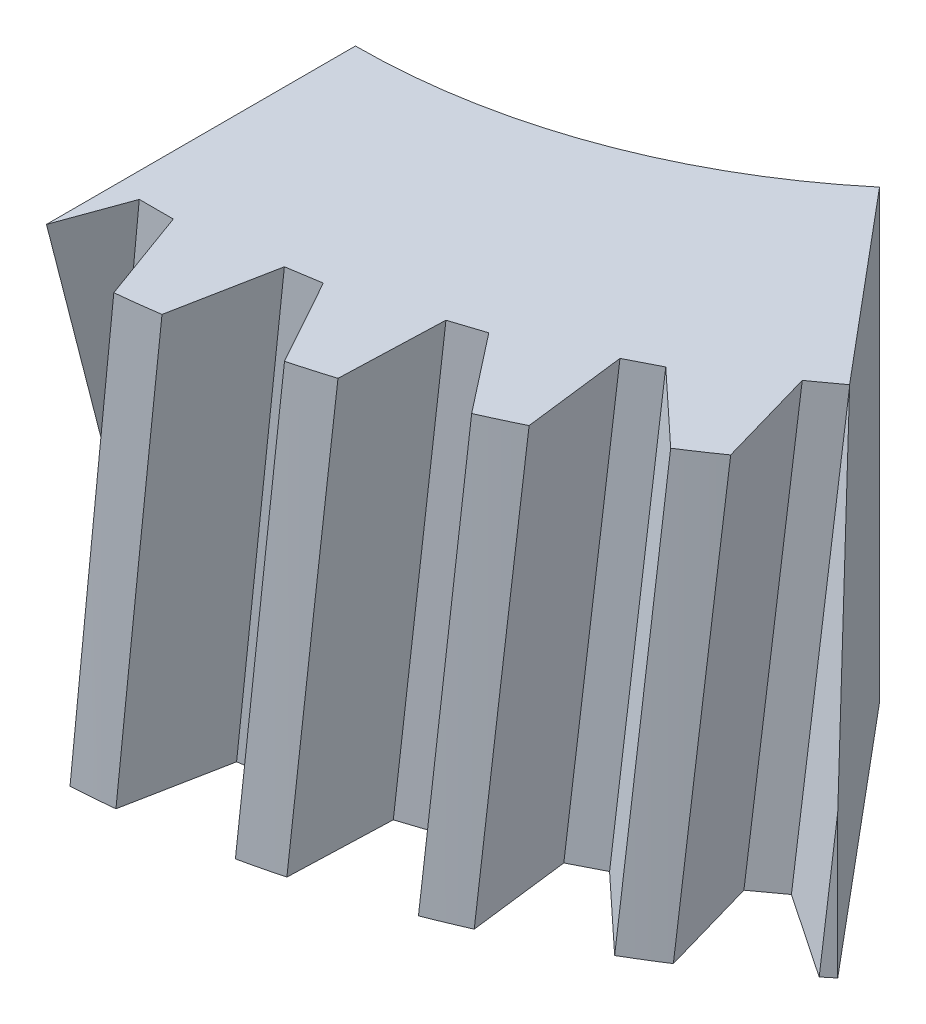
ISO-10303-21;
HEADER;
FILE_DESCRIPTION(('STEP AP214'),'2;1');
FILE_NAME('part.step','',(''),(''),'','','');
FILE_SCHEMA(('AUTOMOTIVE_DESIGN { 1 0 10303 214 1 1 1 1 }'));
ENDSEC;
DATA;
#1=APPLICATION_CONTEXT('core data for automotive mechanical design processes');
#2=APPLICATION_PROTOCOL_DEFINITION('international standard','automotive_design',2000,#1);
#3=PRODUCT_CONTEXT('',#1,'mechanical');
#4=PRODUCT('Part','Part','',(#3));
#5=PRODUCT_RELATED_PRODUCT_CATEGORY('part','',(#4));
#6=PRODUCT_DEFINITION_FORMATION('','',#4);
#7=PRODUCT_DEFINITION_CONTEXT('part definition',#1,'design');
#8=PRODUCT_DEFINITION('design','',#6,#7);
#9=PRODUCT_DEFINITION_SHAPE('','',#8);
#10=(LENGTH_UNIT() NAMED_UNIT(*) SI_UNIT(.MILLI.,.METRE.));
#11=(NAMED_UNIT(*) PLANE_ANGLE_UNIT() SI_UNIT($,.RADIAN.));
#12=(NAMED_UNIT(*) SI_UNIT($,.STERADIAN.) SOLID_ANGLE_UNIT());
#13=UNCERTAINTY_MEASURE_WITH_UNIT(LENGTH_MEASURE(1.E-05),#10,'distance_accuracy_value','');
#14=(GEOMETRIC_REPRESENTATION_CONTEXT(3) GLOBAL_UNCERTAINTY_ASSIGNED_CONTEXT((#13)) GLOBAL_UNIT_ASSIGNED_CONTEXT((#10,
#11,#12)) REPRESENTATION_CONTEXT('',''));
#15=CARTESIAN_POINT('',(0.,0.,0.));
#16=DIRECTION('',(0.,0.,1.));
#17=DIRECTION('',(1.,0.,0.));
#18=AXIS2_PLACEMENT_3D('',#15,#16,#17);
#19=CARTESIAN_POINT('',(0.,0.,0.));
#20=DIRECTION('',(0.,1.,0.));
#21=DIRECTION('',(0.,0.,1.));
#22=AXIS2_PLACEMENT_3D('',#19,#20,#21);
#23=PLANE('',#22);
#24=DIRECTION('',(-0.642787609686541,0.,-0.766044443118977));
#25=VECTOR('',#24,1.);
#26=CARTESIAN_POINT('',(0.,0.,0.));
#27=LINE('',#26,#25);
#28=CARTESIAN_POINT('',(20.247809705126,0.,24.1303999582478));
#29=VERTEX_POINT('',#28);
#30=CARTESIAN_POINT('',(12.9200309546995,0.,15.3974933066914));
#31=VERTEX_POINT('',#30);
#32=EDGE_CURVE('E201',#29,#31,#27,.T.);
#33=ORIENTED_EDGE('',*,*,#32,.F.);
#34=CARTESIAN_POINT('',(0.,0.,0.));
#35=DIRECTION('',(0.,1.,0.));
#36=DIRECTION('',(0.,0.,1.));
#37=AXIS2_PLACEMENT_3D('',#34,#35,#36);
#38=CIRCLE('',#37,31.5);
#39=CARTESIAN_POINT('',(19.9064588685512,0.,24.4127609113488));
#40=VERTEX_POINT('',#39);
#41=EDGE_CURVE('E215',#40,#29,#38,.T.);
#42=ORIENTED_EDGE('',*,*,#41,.F.);
#43=DIRECTION('',(0.829037572555041,0.,0.559192903470748));
#44=VECTOR('',#43,1.);
#45=CARTESIAN_POINT('',(17.0116780244633,0.,22.4602065776191));
#46=LINE('',#45,#44);
#47=CARTESIAN_POINT('',(17.0382315397724,0.,22.4781171498472));
#48=VERTEX_POINT('',#47);
#49=EDGE_CURVE('E298',#48,#40,#46,.T.);
#50=ORIENTED_EDGE('',*,*,#49,.F.);
#51=DIRECTION('',(0.809016994374949,0.,-0.587785252292471));
#52=VECTOR('',#51,1.);
#53=CARTESIAN_POINT('',(16.0370942814478,0.,23.2054859443907));
#54=LINE('',#53,#52);
#55=CARTESIAN_POINT('',(16.112856689523,0.,23.1504413328999));
#56=VERTEX_POINT('',#55);
#57=EDGE_CURVE('E305',#56,#48,#54,.T.);
#58=ORIENTED_EDGE('',*,*,#57,.F.);
#59=DIRECTION('',(-0.275637355816996,0.,-0.96126169593832));
#60=VECTOR('',#59,1.);
#61=CARTESIAN_POINT('',(16.1216851684602,0.,23.1812298978626));
#62=LINE('',#61,#60);
#63=CARTESIAN_POINT('',(17.0664812572855,0.,26.4761254245164));
#64=VERTEX_POINT('',#63);
#65=EDGE_CURVE('E301',#64,#56,#62,.T.);
#66=ORIENTED_EDGE('',*,*,#65,.F.);
#67=CARTESIAN_POINT('',(15.8423801336828,0.,27.2262555578231));
#68=VERTEX_POINT('',#67);
#69=EDGE_CURVE('E224',#68,#64,#38,.T.);
#70=ORIENTED_EDGE('',*,*,#69,.F.);
#71=DIRECTION('',(0.731353701619169,0.,0.6819983600625));
#72=VECTOR('',#71,1.);
#73=CARTESIAN_POINT('',(13.288685638529,0.,24.8448969157054));
#74=LINE('',#73,#72);
#75=CARTESIAN_POINT('',(13.3121104047455,0.,24.8667408635916));
#76=VERTEX_POINT('',#75);
#77=EDGE_CURVE('E280',#76,#68,#74,.T.);
#78=ORIENTED_EDGE('',*,*,#77,.F.);
#79=DIRECTION('',(0.891006524188369,0.,-0.453990499739545));
#80=VECTOR('',#79,1.);
#81=CARTESIAN_POINT('',(12.2095132607794,0.,25.4285421689821));
#82=LINE('',#81,#80);
#83=CARTESIAN_POINT('',(12.2929537805648,0.,25.3860271006324));
#84=VERTEX_POINT('',#83);
#85=EDGE_CURVE('E278',#84,#76,#82,.T.);
#86=ORIENTED_EDGE('',*,*,#85,.F.);
#87=DIRECTION('',(-0.121869343405145,0.,-0.992546151641322));
#88=VECTOR('',#87,1.);
#89=CARTESIAN_POINT('',(12.2968571735085,0.,25.4178176850102));
#90=LINE('',#89,#88);
#91=CARTESIAN_POINT('',(12.7145860356841,0.,28.8199462515319));
#92=VERTEX_POINT('',#91);
#93=EDGE_CURVE('E268',#92,#84,#90,.T.);
#94=ORIENTED_EDGE('',*,*,#93,.F.);
#95=CARTESIAN_POINT('',(11.3882094220779,0.,29.3693494337021));
#96=VERTEX_POINT('',#95);
#97=EDGE_CURVE('E230',#96,#92,#38,.T.);
#98=ORIENTED_EDGE('',*,*,#97,.F.);
#99=DIRECTION('',(0.615661475325656,0.,0.788010753606723));
#100=VECTOR('',#99,1.);
#101=CARTESIAN_POINT('',(9.23848170950866,0.,26.6178234365055));
#102=LINE('',#101,#100);
#103=CARTESIAN_POINT('',(9.25820093119235,0.,26.6430628892929));
#104=VERTEX_POINT('',#103);
#105=EDGE_CURVE('E433',#104,#96,#102,.T.);
#106=ORIENTED_EDGE('',*,*,#105,.F.);
#107=DIRECTION('',(0.951056516295155,0.,-0.309016994374945));
#108=VECTOR('',#107,1.);
#109=CARTESIAN_POINT('',(8.08129350325807,0.,27.0254632932716));
#110=LINE('',#109,#108);
#111=CARTESIAN_POINT('',(8.17035755155453,0.,26.9965246297538));
#112=VERTEX_POINT('',#111);
#113=EDGE_CURVE('E440',#112,#104,#110,.T.);
#114=ORIENTED_EDGE('',*,*,#113,.F.);
#115=DIRECTION('',(0.0348994967025044,0.,-0.999390827019096));
#116=VECTOR('',#115,1.);
#117=CARTESIAN_POINT('',(8.16923974422094,0.,27.0285344436799));
#118=LINE('',#117,#116);
#119=CARTESIAN_POINT('',(8.04961550859229,0.,30.4541243539168));
#120=VERTEX_POINT('',#119);
#121=EDGE_CURVE('E436',#120,#112,#118,.T.);
#122=ORIENTED_EDGE('',*,*,#121,.F.);
#123=CARTESIAN_POINT('',(6.65362319920122,0.,30.7892724552408));
#124=VERTEX_POINT('',#123);
#125=EDGE_CURVE('E237',#124,#120,#38,.T.);
#126=ORIENTED_EDGE('',*,*,#125,.F.);
#127=DIRECTION('',(0.484809620246335,0.,0.874619707139397));
#128=VECTOR('',#127,1.);
#129=CARTESIAN_POINT('',(4.96079569958347,0.,27.7353308044937));
#130=LINE('',#129,#128);
#131=CARTESIAN_POINT('',(4.97632382450596,0.,27.7633442834037));
#132=VERTEX_POINT('',#131);
#133=EDGE_CURVE('E411',#132,#124,#130,.T.);
#134=ORIENTED_EDGE('',*,*,#133,.F.);
#135=DIRECTION('',(0.987688340595138,0.,-0.156434465040228));
#136=VECTOR('',#135,1.);
#137=CARTESIAN_POINT('',(3.75408547809484,0.,27.9569278198432));
#138=LINE('',#137,#136);
#139=CARTESIAN_POINT('',(3.84658000376288,0.,27.9422781261622));
#140=VERTEX_POINT('',#139);
#141=EDGE_CURVE('E418',#140,#132,#138,.T.);
#142=ORIENTED_EDGE('',*,*,#141,.F.);
#143=DIRECTION('',(0.190808995376549,0.,-0.981627183447663));
#144=VECTOR('',#143,1.);
#145=CARTESIAN_POINT('',(3.84046852042425,0.,27.9737189823154));
#146=LINE('',#145,#144);
#147=CARTESIAN_POINT('',(3.18643673253675,0.,31.3384208432643));
#148=VERTEX_POINT('',#147);
#149=EDGE_CURVE('E414',#148,#140,#146,.T.);
#150=ORIENTED_EDGE('',*,*,#149,.F.);
#151=CARTESIAN_POINT('',(1.75520269105084,0.,31.4510614051947));
#152=VERTEX_POINT('',#151);
#153=EDGE_CURVE('E227',#152,#148,#38,.T.);
#154=ORIENTED_EDGE('',*,*,#153,.F.);
#155=DIRECTION('',(0.342020143325666,0.,0.939692620785909));
#156=VECTOR('',#155,1.);
#157=CARTESIAN_POINT('',(0.560958435651995,0.,28.1699022801729));
#158=LINE('',#157,#156);
#159=CARTESIAN_POINT('',(0.57191310978833,0.,28.2));
#160=VERTEX_POINT('',#159);
#161=EDGE_CURVE('E399',#160,#152,#158,.T.);
#162=ORIENTED_EDGE('',*,*,#161,.F.);
#163=DIRECTION('',(1.,0.,0.));
#164=VECTOR('',#163,1.);
#165=CARTESIAN_POINT('',(-0.665560589526791,0.,28.2));
#166=LINE('',#165,#164);
#167=CARTESIAN_POINT('',(0.,0.,28.2));
#168=VERTEX_POINT('',#167);
#169=EDGE_CURVE('E404',#168,#160,#166,.T.);
#170=ORIENTED_EDGE('',*,*,#169,.F.);
#171=DIRECTION('',(0.,0.,1.));
#172=VECTOR('',#171,1.);
#173=CARTESIAN_POINT('',(0.,0.,0.));
#174=LINE('',#173,#172);
#175=CARTESIAN_POINT('',(0.,0.,20.1));
#176=VERTEX_POINT('',#175);
#177=EDGE_CURVE('E68',#176,#168,#174,.T.);
#178=ORIENTED_EDGE('',*,*,#177,.F.);
#179=CARTESIAN_POINT('',(0.,0.,0.));
#180=DIRECTION('',(0.,1.,0.));
#181=DIRECTION('',(0.,0.,1.));
#182=AXIS2_PLACEMENT_3D('',#179,#180,#181);
#183=CIRCLE('',#182,20.1);
#184=EDGE_CURVE('E217',#176,#31,#183,.T.);
#185=ORIENTED_EDGE('',*,*,#184,.T.);
#186=EDGE_LOOP('',(#33,#42,#50,#58,#66,#70,#78,#86,#94,#98,#106,#114,#122,#126,#134,#142,#150,
#154,#162,#170,#178,#185));
#187=FACE_BOUND('',#186,.T.);
#188=ADVANCED_FACE('F45',(#187),#23,.F.);
#189=CARTESIAN_POINT('',(0.,15.,0.));
#190=DIRECTION('',(0.,-1.,0.));
#191=DIRECTION('',(0.,0.,-1.));
#192=AXIS2_PLACEMENT_3D('',#189,#190,#191);
#193=CYLINDRICAL_SURFACE('',#192,31.5);
#194=DIRECTION('',(0.,1.,0.));
#195=VECTOR('',#194,1.);
#196=CARTESIAN_POINT('',(20.247809705126,0.,24.1303999582478));
#197=LINE('',#196,#195);
#198=CARTESIAN_POINT('',(20.247809705126,4.82920141502459,24.1303999582478));
#199=VERTEX_POINT('',#198);
#200=EDGE_CURVE('E198',#29,#199,#197,.T.);
#201=ORIENTED_EDGE('',*,*,#200,.T.);
#202=CARTESIAN_POINT('',(0.,103.495059418198,0.));
#203=DIRECTION('',(0.557040212659675,-0.0876610419991453,-0.825846077181268));
#204=DIRECTION('',(-0.0490194325967733,-0.996150360997588,0.0726742974666169));
#205=AXIS2_PLACEMENT_3D('',#202,#203,#204);
#206=ELLIPSE('',#205,359.338644415237,31.5);
#207=EDGE_CURVE('E221',#199,#40,#206,.T.);
#208=ORIENTED_EDGE('',*,*,#207,.T.);
#209=ORIENTED_EDGE('',*,*,#41,.T.);
#210=EDGE_LOOP('',(#201,#208,#209));
#211=FACE_BOUND('',#210,.T.);
#212=ADVANCED_FACE('F47',(#211),#193,.T.);
#213=CARTESIAN_POINT('',(0.,15.,0.));
#214=DIRECTION('',(0.,1.,0.));
#215=DIRECTION('',(0.,0.,1.));
#216=AXIS2_PLACEMENT_3D('',#213,#214,#215);
#217=PLANE('',#216);
#218=DIRECTION('',(-0.809016994374949,0.,0.587785252292471));
#219=VECTOR('',#218,1.);
#220=CARTESIAN_POINT('',(16.5755441146477,15.,22.8142792413736));
#221=LINE('',#220,#219);
#222=CARTESIAN_POINT('',(18.1708739287861,15.,21.6552042852071));
#223=VERTEX_POINT('',#222);
#224=CARTESIAN_POINT('',(17.2492922612863,15.,22.3247725596758));
#225=VERTEX_POINT('',#224);
#226=EDGE_CURVE('E322',#223,#225,#221,.T.);
#227=ORIENTED_EDGE('',*,*,#226,.F.);
#228=DIRECTION('',(-0.642787609686541,0.,-0.766044443118977));
#229=VECTOR('',#228,1.);
#230=CARTESIAN_POINT('',(0.,15.,0.));
#231=LINE('',#230,#229);
#232=CARTESIAN_POINT('',(12.9200309546995,15.,15.3974933066914));
#233=VERTEX_POINT('',#232);
#234=EDGE_CURVE('E60',#223,#233,#231,.T.);
#235=ORIENTED_EDGE('',*,*,#234,.T.);
#236=CARTESIAN_POINT('',(0.,15.,0.));
#237=DIRECTION('',(0.,1.,0.));
#238=DIRECTION('',(0.,0.,1.));
#239=AXIS2_PLACEMENT_3D('',#236,#237,#238);
#240=CIRCLE('',#239,20.1);
#241=CARTESIAN_POINT('',(0.,15.,20.1));
#242=VERTEX_POINT('',#241);
#243=EDGE_CURVE('E225',#242,#233,#240,.T.);
#244=ORIENTED_EDGE('',*,*,#243,.F.);
#245=DIRECTION('',(0.,0.,1.));
#246=VECTOR('',#245,1.);
#247=CARTESIAN_POINT('',(0.,15.,0.));
#248=LINE('',#247,#246);
#249=CARTESIAN_POINT('',(0.,15.,30.4880950983221));
#250=VERTEX_POINT('',#249);
#251=EDGE_CURVE('E219',#242,#250,#248,.T.);
#252=ORIENTED_EDGE('',*,*,#251,.T.);
#253=DIRECTION('',(-0.342020143325673,0.,0.939692620785907));
#254=VECTOR('',#253,1.);
#255=CARTESIAN_POINT('',(9.79868488607328,15.,3.56642963348484));
#256=LINE('',#255,#254);
#257=CARTESIAN_POINT('',(0.832798508959667,15.,28.2));
#258=VERTEX_POINT('',#257);
#259=EDGE_CURVE('E374',#258,#250,#256,.T.);
#260=ORIENTED_EDGE('',*,*,#259,.F.);
#261=DIRECTION('',(-1.,0.,0.));
#262=VECTOR('',#261,1.);
#263=CARTESIAN_POINT('',(0.,15.,28.2));
#264=LINE('',#263,#262);
#265=CARTESIAN_POINT('',(1.97662472853652,15.,28.2));
#266=VERTEX_POINT('',#265);
#267=EDGE_CURVE('E366',#266,#258,#264,.T.);
#268=ORIENTED_EDGE('',*,*,#267,.F.);
#269=DIRECTION('',(-0.342020143325666,0.,-0.939692620785909));
#270=VECTOR('',#269,1.);
#271=CARTESIAN_POINT('',(-7.3179017375984,15.,2.66349840977071));
#272=LINE('',#271,#270);
#273=CARTESIAN_POINT('',(3.12130210554712,15.,31.3449752458972));
#274=VERTEX_POINT('',#273);
#275=EDGE_CURVE('E370',#274,#266,#272,.T.);
#276=ORIENTED_EDGE('',*,*,#275,.F.);
#277=CARTESIAN_POINT('',(0.,15.,0.));
#278=DIRECTION('',(0.,1.,0.));
#279=DIRECTION('',(0.,0.,1.));
#280=AXIS2_PLACEMENT_3D('',#277,#278,#279);
#281=CIRCLE('',#280,31.5);
#282=CARTESIAN_POINT('',(4.56435217650809,15.,31.1675582811488));
#283=VERTEX_POINT('',#282);
#284=EDGE_CURVE('E246',#274,#283,#281,.T.);
#285=ORIENTED_EDGE('',*,*,#284,.T.);
#286=DIRECTION('',(-0.190808995376549,0.,0.981627183447663));
#287=VECTOR('',#286,1.);
#288=CARTESIAN_POINT('',(10.2359593269582,15.,1.98966893829529));
#289=LINE('',#288,#287);
#290=CARTESIAN_POINT('',(5.233997291499,15.,27.7225328155475));
#291=VERTEX_POINT('',#290);
#292=EDGE_CURVE('E363',#291,#283,#289,.T.);
#293=ORIENTED_EDGE('',*,*,#292,.F.);
#294=DIRECTION('',(-0.987688340595138,0.,0.156434465040228));
#295=VECTOR('',#294,1.);
#296=CARTESIAN_POINT('',(4.41145191413442,15.,27.8528112047829));
#297=LINE('',#296,#295);
#298=CARTESIAN_POINT('',(6.36374111224207,15.,27.543598972789));
#299=VERTEX_POINT('',#298);
#300=EDGE_CURVE('E352',#299,#291,#297,.T.);
#301=ORIENTED_EDGE('',*,*,#300,.F.);
#302=DIRECTION('',(-0.484809620246335,0.,-0.874619707139397));
#303=VECTOR('',#302,1.);
#304=CARTESIAN_POINT('',(-6.81114327497885,15.,3.77547836806241));
#305=LINE('',#304,#303);
#306=CARTESIAN_POINT('',(7.98630813141515,15.,30.4707873615056));
#307=VERTEX_POINT('',#306);
#308=EDGE_CURVE('E359',#307,#299,#305,.T.);
#309=ORIENTED_EDGE('',*,*,#308,.F.);
#310=CARTESIAN_POINT('',(9.38383773342882,15.,30.0698119281228));
#311=VERTEX_POINT('',#310);
#312=EDGE_CURVE('E323',#307,#311,#281,.T.);
#313=ORIENTED_EDGE('',*,*,#312,.T.);
#314=DIRECTION('',(-0.0348994967025044,0.,0.999390827019096));
#315=VECTOR('',#314,1.);
#316=CARTESIAN_POINT('',(10.4211904780121,15.,0.363915990512291));
#317=LINE('',#316,#315);
#318=CARTESIAN_POINT('',(9.50631769008051,15.,26.5624448673647));
#319=VERTEX_POINT('',#318);
#320=EDGE_CURVE('E348',#319,#311,#317,.T.);
#321=ORIENTED_EDGE('',*,*,#320,.F.);
#322=DIRECTION('',(-0.951056516295155,0.,0.309016994374945));
#323=VECTOR('',#322,1.);
#324=CARTESIAN_POINT('',(8.71427924137344,15.,26.8197937595234));
#325=LINE('',#324,#323);
#326=CARTESIAN_POINT('',(10.5941610697183,15.,26.2089831269038));
#327=VERTEX_POINT('',#326);
#328=EDGE_CURVE('E344',#327,#319,#325,.T.);
#329=ORIENTED_EDGE('',*,*,#328,.F.);
#330=DIRECTION('',(-0.615661475325656,0.,-0.788010753606723));
#331=VECTOR('',#330,1.);
#332=CARTESIAN_POINT('',(-6.13667186004078,15.,4.79449351883808));
#333=LINE('',#332,#331);
#334=CARTESIAN_POINT('',(12.6546647460507,15.,28.8463075655284));
#335=VERTEX_POINT('',#334);
#336=EDGE_CURVE('E343',#335,#327,#333,.T.);
#337=ORIENTED_EDGE('',*,*,#336,.F.);
#338=CARTESIAN_POINT('',(13.9722620621806,15.,28.2316470094422));
#339=VERTEX_POINT('',#338);
#340=EDGE_CURVE('E245',#335,#339,#281,.T.);
#341=ORIENTED_EDGE('',*,*,#340,.T.);
#342=DIRECTION('',(0.121869343405145,0.,0.992546151641322));
#343=VECTOR('',#342,1.);
#344=CARTESIAN_POINT('',(10.349817333549,15.,-1.27079777672505));
#345=LINE('',#344,#343);
#346=CARTESIAN_POINT('',(13.5445609974727,15.,24.748301370847));
#347=VERTEX_POINT('',#346);
#348=EDGE_CURVE('E271',#347,#339,#345,.T.);
#349=ORIENTED_EDGE('',*,*,#348,.F.);
#350=DIRECTION('',(-0.891006524188369,0.,0.453990499739545));
#351=VECTOR('',#350,1.);
#352=CARTESIAN_POINT('',(12.8025320926552,15.,25.126383982112));
#353=LINE('',#352,#351);
#354=CARTESIAN_POINT('',(14.5637176216533,15.,24.2290151338061));
#355=VERTEX_POINT('',#354);
#356=EDGE_CURVE('E680',#355,#347,#353,.T.);
#357=ORIENTED_EDGE('',*,*,#356,.F.);
#358=DIRECTION('',(-0.731353701619169,0.,-0.6819983600625));
#359=VECTOR('',#358,1.);
#360=CARTESIAN_POINT('',(-5.31109521746227,15.,5.69545232716825));
#361=LINE('',#360,#359);
#362=CARTESIAN_POINT('',(17.011421516214,15.,26.5115359418818));
#363=VERTEX_POINT('',#362);
#364=EDGE_CURVE('E679',#363,#355,#361,.T.);
#365=ORIENTED_EDGE('',*,*,#364,.F.);
#366=CARTESIAN_POINT('',(18.2166429276823,15.,25.6983252459245));
#367=VERTEX_POINT('',#366);
#368=EDGE_CURVE('E236',#363,#367,#281,.T.);
#369=ORIENTED_EDGE('',*,*,#368,.T.);
#370=DIRECTION('',(0.275637355816996,0.,0.96126169593832));
#371=VECTOR('',#370,1.);
#372=CARTESIAN_POINT('',(10.0235973372595,15.,-2.87422028516339));
#373=LINE('',#372,#371);
#374=EDGE_CURVE('E331',#225,#367,#373,.T.);
#375=ORIENTED_EDGE('',*,*,#374,.F.);
#376=EDGE_LOOP('',(#227,#235,#244,#252,#260,#268,#276,#285,#293,#301,#309,#313,#321,#329,#337,
#341,#349,#357,#365,#369,#375));
#377=FACE_BOUND('',#376,.T.);
#378=ADVANCED_FACE('F339',(#377),#217,.T.);
#379=CARTESIAN_POINT('',(0.,15.,0.));
#380=DIRECTION('',(0.,-1.,0.));
#381=DIRECTION('',(0.,0.,-1.));
#382=AXIS2_PLACEMENT_3D('',#379,#380,#381);
#383=CYLINDRICAL_SURFACE('',#382,20.1);
#384=ORIENTED_EDGE('',*,*,#243,.T.);
#385=DIRECTION('',(0.,-1.,0.));
#386=VECTOR('',#385,1.);
#387=CARTESIAN_POINT('',(12.9200309546995,15.,15.3974933066914));
#388=LINE('',#387,#386);
#389=EDGE_CURVE('E395',#233,#31,#388,.T.);
#390=ORIENTED_EDGE('',*,*,#389,.T.);
#391=ORIENTED_EDGE('',*,*,#184,.F.);
#392=DIRECTION('',(0.,-1.,0.));
#393=VECTOR('',#392,1.);
#394=CARTESIAN_POINT('',(0.,15.,20.1));
#395=LINE('',#394,#393);
#396=EDGE_CURVE('E389',#176,#242,#395,.F.);
#397=ORIENTED_EDGE('',*,*,#396,.T.);
#398=EDGE_LOOP('',(#384,#390,#391,#397));
#399=FACE_BOUND('',#398,.T.);
#400=ADVANCED_FACE('F480',(#399),#383,.F.);
#401=CARTESIAN_POINT('',(16.9624691316971,-1.00000048341122,22.533161761338));
#402=DIRECTION('',(0.557040212659675,-0.0876610419991453,-0.825846077181268));
#403=DIRECTION('',(-0.829037572555041,0.,-0.559192903470748));
#404=AXIS2_PLACEMENT_3D('',#401,#402,#403);
#405=PLANE('',#404);
#406=DIRECTION('',(0.195494629199284,-0.952628733965056,0.232981426681119));
#407=VECTOR('',#406,1.);
#408=CARTESIAN_POINT('',(21.1350956957273,0.505532098105738,25.1878262252053));
#409=LINE('',#408,#407);
#410=CARTESIAN_POINT('',(18.1708739287861,14.9499331570951,21.6552042852071));
#411=VERTEX_POINT('',#410);
#412=EDGE_CURVE('E204',#411,#199,#409,.T.);
#413=ORIENTED_EDGE('',*,*,#412,.F.);
#414=DIRECTION('',(0.0754323286281528,0.99564371050683,-0.0548047947348293));
#415=VECTOR('',#414,1.);
#416=CARTESIAN_POINT('',(16.9624691316971,-1.00000048341122,22.533161761338));
#417=LINE('',#416,#415);
#418=EDGE_CURVE('E302',#48,#411,#417,.T.);
#419=ORIENTED_EDGE('',*,*,#418,.F.);
#420=ORIENTED_EDGE('',*,*,#49,.T.);
#421=ORIENTED_EDGE('',*,*,#207,.F.);
#422=EDGE_LOOP('',(#413,#419,#420,#421));
#423=FACE_BOUND('',#422,.T.);
#424=ADVANCED_FACE('F483',(#423),#405,.F.);
#425=CARTESIAN_POINT('',(16.0370942814478,-1.00000048341122,23.2054859443907));
#426=DIRECTION('',(-0.587785252292471,0.,-0.809016994374949));
#427=DIRECTION('',(-0.809016994374949,0.,0.587785252292471));
#428=AXIS2_PLACEMENT_3D('',#425,#426,#427);
#429=PLANE('',#428);
#430=DIRECTION('',(0.,-1.,0.));
#431=VECTOR('',#430,1.);
#432=CARTESIAN_POINT('',(18.1708739287861,-1.00000048341122,21.6552042852072));
#433=LINE('',#432,#431);
#434=EDGE_CURVE('E12',#223,#411,#433,.T.);
#435=ORIENTED_EDGE('',*,*,#434,.F.);
#436=ORIENTED_EDGE('',*,*,#226,.T.);
#437=DIRECTION('',(0.0754323286281528,0.99564371050683,-0.0548047947348293));
#438=VECTOR('',#437,1.);
#439=CARTESIAN_POINT('',(16.0370942814478,-1.00000048341122,23.2054859443907));
#440=LINE('',#439,#438);
#441=EDGE_CURVE('E273',#56,#225,#440,.T.);
#442=ORIENTED_EDGE('',*,*,#441,.F.);
#443=ORIENTED_EDGE('',*,*,#57,.T.);
#444=ORIENTED_EDGE('',*,*,#418,.T.);
#445=EDGE_LOOP('',(#435,#436,#442,#443,#444));
#446=FACE_BOUND('',#445,.T.);
#447=ADVANCED_FACE('F485',(#446),#429,.F.);
#448=CARTESIAN_POINT('',(-0.665560589526791,-1.00000041099238,28.2));
#449=DIRECTION('',(-0.936075143422651,0.0876610419991454,-0.340703489242315));
#450=DIRECTION('',(-0.342020143325673,0.,0.939692620785907));
#451=AXIS2_PLACEMENT_3D('',#448,#449,#450);
#452=PLANE('',#451);
#453=DIRECTION('',(0.,0.968457564108189,0.249178543461579));
#454=VECTOR('',#453,1.);
#455=CARTESIAN_POINT('',(0.,-0.558721708028581,26.4849257731894));
#456=LINE('',#455,#454);
#457=CARTESIAN_POINT('',(0.,6.107087413766,28.2));
#458=VERTEX_POINT('',#457);
#459=EDGE_CURVE('E209',#458,#250,#456,.T.);
#460=ORIENTED_EDGE('',*,*,#459,.F.);
#461=DIRECTION('',(0.0932394858855004,0.99564371050683,0.));
#462=VECTOR('',#461,1.);
#463=CARTESIAN_POINT('',(-0.665560589526791,-1.00000041099238,28.2));
#464=LINE('',#463,#462);
#465=EDGE_CURVE('E386',#458,#258,#464,.T.);
#466=ORIENTED_EDGE('',*,*,#465,.T.);
#467=ORIENTED_EDGE('',*,*,#259,.T.);
#468=EDGE_LOOP('',(#460,#466,#467));
#469=FACE_BOUND('',#468,.T.);
#470=ADVANCED_FACE('F385',(#469),#452,.F.);
#471=CARTESIAN_POINT('',(-0.665560589526791,-1.00000041099238,28.2));
#472=DIRECTION('',(0.,0.,-1.));
#473=DIRECTION('',(-1.,0.,0.));
#474=AXIS2_PLACEMENT_3D('',#471,#472,#473);
#475=PLANE('',#474);
#476=DIRECTION('',(0.,1.,0.));
#477=VECTOR('',#476,1.);
#478=CARTESIAN_POINT('',(0.,-1.00000041099238,28.2));
#479=LINE('',#478,#477);
#480=EDGE_CURVE('E54',#168,#458,#479,.T.);
#481=ORIENTED_EDGE('',*,*,#480,.F.);
#482=ORIENTED_EDGE('',*,*,#169,.T.);
#483=DIRECTION('',(0.0932394858855004,0.99564371050683,0.));
#484=VECTOR('',#483,1.);
#485=CARTESIAN_POINT('',(0.478265630050065,-1.00000041099238,28.2));
#486=LINE('',#485,#484);
#487=EDGE_CURVE('E394',#160,#266,#486,.T.);
#488=ORIENTED_EDGE('',*,*,#487,.T.);
#489=ORIENTED_EDGE('',*,*,#267,.T.);
#490=ORIENTED_EDGE('',*,*,#465,.F.);
#491=EDGE_LOOP('',(#481,#482,#488,#489,#490));
#492=FACE_BOUND('',#491,.T.);
#493=ADVANCED_FACE('F391',(#492),#475,.F.);
#494=ORIENTED_EDGE('',*,*,#284,.F.);
#495=CARTESIAN_POINT('',(0.,103.495059418198,0.));
#496=DIRECTION('',(0.936075143422653,-0.0876610419991453,-0.340703489242309));
#497=DIRECTION('',(-0.0823744342970005,-0.996150360997588,0.0299818421486249));
#498=AXIS2_PLACEMENT_3D('',#495,#496,#497);
#499=ELLIPSE('',#498,359.338644415237,31.5);
#500=EDGE_CURVE('E407',#274,#152,#499,.T.);
#501=ORIENTED_EDGE('',*,*,#500,.T.);
#502=ORIENTED_EDGE('',*,*,#153,.T.);
#503=CARTESIAN_POINT('',(0.,-103.495059418198,0.));
#504=DIRECTION('',(-0.977848273156435,0.0876610419991454,-0.190074449625936));
#505=DIRECTION('',(-0.0860504617557084,-0.996150360997588,-0.0167265153575184));
#506=AXIS2_PLACEMENT_3D('',#503,#504,#505);
#507=ELLIPSE('',#506,359.338644415236,31.5);
#508=EDGE_CURVE('E429',#148,#283,#507,.T.);
#509=ORIENTED_EDGE('',*,*,#508,.T.);
#510=EDGE_LOOP('',(#494,#501,#502,#509));
#511=FACE_BOUND('',#510,.T.);
#512=ADVANCED_FACE('F475',(#511),#193,.T.);
#513=ORIENTED_EDGE('',*,*,#312,.F.);
#514=CARTESIAN_POINT('',(0.,103.495059418198,0.));
#515=DIRECTION('',(0.871252737002515,-0.0876610419991454,-0.48294327822349));
#516=DIRECTION('',(-0.0766700748808269,-0.996150360997588,0.0424989164820037));
#517=AXIS2_PLACEMENT_3D('',#514,#515,#516);
#518=ELLIPSE('',#517,359.338644415236,31.5);
#519=EDGE_CURVE('E426',#307,#124,#518,.T.);
#520=ORIENTED_EDGE('',*,*,#519,.T.);
#521=ORIENTED_EDGE('',*,*,#125,.T.);
#522=CARTESIAN_POINT('',(0.,-103.495059418198,0.));
#523=DIRECTION('',(-0.99554353311275,0.0876610419991454,-0.0347651462388339));
#524=DIRECTION('',(-0.0876076412608816,-0.996150360997588,-0.00305932624618728));
#525=AXIS2_PLACEMENT_3D('',#522,#523,#524);
#526=ELLIPSE('',#525,359.338644415236,31.5);
#527=EDGE_CURVE('E292',#120,#311,#526,.T.);
#528=ORIENTED_EDGE('',*,*,#527,.T.);
#529=EDGE_LOOP('',(#513,#520,#521,#528));
#530=FACE_BOUND('',#529,.T.);
#531=ADVANCED_FACE('F450',(#530),#193,.T.);
#532=ORIENTED_EDGE('',*,*,#340,.F.);
#533=CARTESIAN_POINT('',(0.,103.495059418198,0.));
#534=DIRECTION('',(0.784977196675319,-0.0876610419991454,-0.61329140089796));
#535=DIRECTION('',(-0.0690778437676972,-0.996150360997588,0.0539695264457782));
#536=AXIS2_PLACEMENT_3D('',#533,#534,#535);
#537=ELLIPSE('',#536,359.338644415236,31.5);
#538=EDGE_CURVE('E261',#335,#96,#537,.T.);
#539=ORIENTED_EDGE('',*,*,#538,.T.);
#540=ORIENTED_EDGE('',*,*,#97,.T.);
#541=CARTESIAN_POINT('',(0.,-103.495059418198,0.));
#542=DIRECTION('',(-0.98872520726427,0.0876610419991453,0.121400190427574));
#543=DIRECTION('',(-0.08700762988512,-0.996150360997588,0.0106831936306466));
#544=AXIS2_PLACEMENT_3D('',#541,#542,#543);
#545=ELLIPSE('',#544,359.338644415237,31.5);
#546=EDGE_CURVE('E260',#92,#339,#545,.T.);
#547=ORIENTED_EDGE('',*,*,#546,.T.);
#548=EDGE_LOOP('',(#532,#539,#540,#547));
#549=FACE_BOUND('',#548,.T.);
#550=ADVANCED_FACE('F259',(#549),#193,.T.);
#551=ORIENTED_EDGE('',*,*,#368,.F.);
#552=CARTESIAN_POINT('',(0.,103.495059418198,0.));
#553=DIRECTION('',(0.679372912576022,-0.0876610419991453,-0.728538253884857));
#554=DIRECTION('',(-0.059784686884787,-0.996150360997588,0.0641112275538684));
#555=AXIS2_PLACEMENT_3D('',#552,#553,#554);
#556=ELLIPSE('',#555,359.338644415237,31.5);
#557=EDGE_CURVE('E274',#363,#68,#556,.T.);
#558=ORIENTED_EDGE('',*,*,#557,.T.);
#559=ORIENTED_EDGE('',*,*,#69,.T.);
#560=CARTESIAN_POINT('',(0.,-103.495059418198,0.));
#561=DIRECTION('',(-0.95756118542211,0.0876610419991452,0.274576251501522));
#562=DIRECTION('',(-0.0842652018998186,-0.996150360997588,0.0241626578248071));
#563=AXIS2_PLACEMENT_3D('',#560,#561,#562);
#564=ELLIPSE('',#563,359.338644415237,31.5);
#565=EDGE_CURVE('E316',#64,#367,#564,.T.);
#566=ORIENTED_EDGE('',*,*,#565,.T.);
#567=EDGE_LOOP('',(#551,#558,#559,#566));
#568=FACE_BOUND('',#567,.T.);
#569=ADVANCED_FACE('F476',(#568),#193,.T.);
#570=CARTESIAN_POINT('',(16.0370942814478,-1.00000048341122,23.2054859443907));
#571=DIRECTION('',(-0.95756118542211,0.0876610419991452,0.274576251501522));
#572=DIRECTION('',(0.275637355816996,0.,0.96126169593832));
#573=AXIS2_PLACEMENT_3D('',#570,#571,#572);
#574=PLANE('',#573);
#575=ORIENTED_EDGE('',*,*,#65,.T.);
#576=ORIENTED_EDGE('',*,*,#441,.T.);
#577=ORIENTED_EDGE('',*,*,#374,.T.);
#578=ORIENTED_EDGE('',*,*,#565,.F.);
#579=EDGE_LOOP('',(#575,#576,#577,#578));
#580=FACE_BOUND('',#579,.T.);
#581=ADVANCED_FACE('F492',(#580),#574,.F.);
#582=CARTESIAN_POINT('',(12.2095132607794,-1.00000046330267,25.4285421689821));
#583=DIRECTION('',(-0.98872520726427,0.0876610419991453,0.121400190427574));
#584=DIRECTION('',(0.121869343405145,0.,0.992546151641322));
#585=AXIS2_PLACEMENT_3D('',#582,#583,#584);
#586=PLANE('',#585);
#587=ORIENTED_EDGE('',*,*,#93,.T.);
#588=DIRECTION('',(0.0830769902359502,0.99564371050683,-0.0423298407926165));
#589=VECTOR('',#588,1.);
#590=CARTESIAN_POINT('',(12.2095132607794,-1.00000046330267,25.4285421689821));
#591=LINE('',#590,#589);
#592=EDGE_CURVE('E289',#84,#347,#591,.T.);
#593=ORIENTED_EDGE('',*,*,#592,.T.);
#594=ORIENTED_EDGE('',*,*,#348,.T.);
#595=ORIENTED_EDGE('',*,*,#546,.F.);
#596=EDGE_LOOP('',(#587,#593,#594,#595));
#597=FACE_BOUND('',#596,.T.);
#598=ADVANCED_FACE('F266',(#597),#586,.F.);
#599=CARTESIAN_POINT('',(13.2286698849601,-1.00000046330267,24.9092559319413));
#600=DIRECTION('',(0.679372912576022,-0.0876610419991453,-0.728538253884857));
#601=DIRECTION('',(-0.731353701619169,0.,-0.6819983600625));
#602=AXIS2_PLACEMENT_3D('',#599,#600,#601);
#603=PLANE('',#602);
#604=ORIENTED_EDGE('',*,*,#364,.T.);
#605=DIRECTION('',(0.0830769902359502,0.99564371050683,-0.0423298407926165));
#606=VECTOR('',#605,1.);
#607=CARTESIAN_POINT('',(13.2286698849601,-1.00000046330267,24.9092559319413));
#608=LINE('',#607,#606);
#609=EDGE_CURVE('E285',#76,#355,#608,.T.);
#610=ORIENTED_EDGE('',*,*,#609,.F.);
#611=ORIENTED_EDGE('',*,*,#77,.T.);
#612=ORIENTED_EDGE('',*,*,#557,.F.);
#613=EDGE_LOOP('',(#604,#610,#611,#612));
#614=FACE_BOUND('',#613,.T.);
#615=ADVANCED_FACE('F498',(#614),#603,.F.);
#616=CARTESIAN_POINT('',(12.2095132607794,-1.00000046330267,25.4285421689821));
#617=DIRECTION('',(-0.453990499739545,0.,-0.891006524188369));
#618=DIRECTION('',(-0.891006524188369,0.,0.453990499739545));
#619=AXIS2_PLACEMENT_3D('',#616,#617,#618);
#620=PLANE('',#619);
#621=ORIENTED_EDGE('',*,*,#356,.T.);
#622=ORIENTED_EDGE('',*,*,#592,.F.);
#623=ORIENTED_EDGE('',*,*,#85,.T.);
#624=ORIENTED_EDGE('',*,*,#609,.T.);
#625=EDGE_LOOP('',(#621,#622,#623,#624));
#626=FACE_BOUND('',#625,.T.);
#627=ADVANCED_FACE('F468',(#626),#620,.F.);
#628=CARTESIAN_POINT('',(8.08129350325807,-1.00000043857663,27.0254632932716));
#629=DIRECTION('',(-0.99554353311275,0.0876610419991454,-0.0347651462388339));
#630=DIRECTION('',(-0.0877140643090377,-0.996145693622369,0.));
#631=AXIS2_PLACEMENT_3D('',#628,#629,#630);
#632=PLANE('',#631);
#633=ORIENTED_EDGE('',*,*,#121,.T.);
#634=DIRECTION('',(0.0886760206274153,0.99564371050683,-0.0288125856854024));
#635=VECTOR('',#634,1.);
#636=CARTESIAN_POINT('',(8.08129350325807,-1.00000043857663,27.0254632932716));
#637=LINE('',#636,#635);
#638=EDGE_CURVE('E432',#112,#319,#637,.T.);
#639=ORIENTED_EDGE('',*,*,#638,.T.);
#640=ORIENTED_EDGE('',*,*,#320,.T.);
#641=ORIENTED_EDGE('',*,*,#527,.F.);
#642=EDGE_LOOP('',(#633,#639,#640,#641));
#643=FACE_BOUND('',#642,.T.);
#644=ADVANCED_FACE('F453',(#643),#632,.F.);
#645=CARTESIAN_POINT('',(9.1691368828959,-1.00000043857663,26.6720015528107));
#646=DIRECTION('',(0.784977196675319,-0.0876610419991454,-0.61329140089796));
#647=DIRECTION('',(-0.615661475325656,0.,-0.788010753606723));
#648=AXIS2_PLACEMENT_3D('',#645,#646,#647);
#649=PLANE('',#648);
#650=ORIENTED_EDGE('',*,*,#336,.T.);
#651=DIRECTION('',(0.0886760206274153,0.99564371050683,-0.0288125856854024));
#652=VECTOR('',#651,1.);
#653=CARTESIAN_POINT('',(9.1691368828959,-1.00000043857663,26.6720015528107));
#654=LINE('',#653,#652);
#655=EDGE_CURVE('E437',#104,#327,#654,.T.);
#656=ORIENTED_EDGE('',*,*,#655,.F.);
#657=ORIENTED_EDGE('',*,*,#105,.T.);
#658=ORIENTED_EDGE('',*,*,#538,.F.);
#659=EDGE_LOOP('',(#650,#656,#657,#658));
#660=FACE_BOUND('',#659,.T.);
#661=ADVANCED_FACE('F459',(#660),#649,.F.);
#662=CARTESIAN_POINT('',(8.08129350325807,-1.00000043857663,27.0254632932716));
#663=DIRECTION('',(-0.309016994374945,0.,-0.951056516295155));
#664=DIRECTION('',(-0.951056516295155,0.,0.309016994374945));
#665=AXIS2_PLACEMENT_3D('',#662,#663,#664);
#666=PLANE('',#665);
#667=ORIENTED_EDGE('',*,*,#328,.T.);
#668=ORIENTED_EDGE('',*,*,#638,.F.);
#669=ORIENTED_EDGE('',*,*,#113,.T.);
#670=ORIENTED_EDGE('',*,*,#655,.T.);
#671=EDGE_LOOP('',(#667,#668,#669,#670));
#672=FACE_BOUND('',#671,.T.);
#673=ADVANCED_FACE('F458',(#672),#666,.F.);
#674=CARTESIAN_POINT('',(3.75408547809484,-1.00000043050103,27.9569278198432));
#675=DIRECTION('',(-0.977848273156435,0.0876610419991454,-0.190074449625936));
#676=DIRECTION('',(-0.190808995376549,0.,0.981627183447663));
#677=AXIS2_PLACEMENT_3D('',#674,#675,#676);
#678=PLANE('',#677);
#679=ORIENTED_EDGE('',*,*,#149,.T.);
#680=DIRECTION('',(0.0920915530921938,0.99564371050683,-0.0145858690951241));
#681=VECTOR('',#680,1.);
#682=CARTESIAN_POINT('',(3.75408547809484,-1.00000043050103,27.9569278198432));
#683=LINE('',#682,#681);
#684=EDGE_CURVE('E410',#140,#291,#683,.T.);
#685=ORIENTED_EDGE('',*,*,#684,.T.);
#686=ORIENTED_EDGE('',*,*,#292,.T.);
#687=ORIENTED_EDGE('',*,*,#508,.F.);
#688=EDGE_LOOP('',(#679,#685,#686,#687));
#689=FACE_BOUND('',#688,.T.);
#690=ADVANCED_FACE('F466',(#689),#678,.F.);
#691=CARTESIAN_POINT('',(4.88382929883791,-1.00000043050103,27.7779939770847));
#692=DIRECTION('',(0.871252737002515,-0.0876610419991454,-0.48294327822349));
#693=DIRECTION('',(-0.484809620246335,0.,-0.874619707139397));
#694=AXIS2_PLACEMENT_3D('',#691,#692,#693);
#695=PLANE('',#694);
#696=ORIENTED_EDGE('',*,*,#308,.T.);
#697=DIRECTION('',(0.0920915530921938,0.99564371050683,-0.0145858690951241));
#698=VECTOR('',#697,1.);
#699=CARTESIAN_POINT('',(4.88382929883791,-1.00000043050103,27.7779939770847));
#700=LINE('',#699,#698);
#701=EDGE_CURVE('E415',#132,#299,#700,.T.);
#702=ORIENTED_EDGE('',*,*,#701,.F.);
#703=ORIENTED_EDGE('',*,*,#133,.T.);
#704=ORIENTED_EDGE('',*,*,#519,.F.);
#705=EDGE_LOOP('',(#696,#702,#703,#704));
#706=FACE_BOUND('',#705,.T.);
#707=ADVANCED_FACE('F544',(#706),#695,.F.);
#708=CARTESIAN_POINT('',(3.75408547809484,-1.00000043050103,27.9569278198432));
#709=DIRECTION('',(-0.156434465040228,0.,-0.987688340595138));
#710=DIRECTION('',(-0.987688340595138,0.,0.156434465040228));
#711=AXIS2_PLACEMENT_3D('',#708,#709,#710);
#712=PLANE('',#711);
#713=ORIENTED_EDGE('',*,*,#300,.T.);
#714=ORIENTED_EDGE('',*,*,#684,.F.);
#715=ORIENTED_EDGE('',*,*,#141,.T.);
#716=ORIENTED_EDGE('',*,*,#701,.T.);
#717=EDGE_LOOP('',(#713,#714,#715,#716));
#718=FACE_BOUND('',#717,.T.);
#719=ADVANCED_FACE('F554',(#718),#712,.F.);
#720=CARTESIAN_POINT('',(0.478265630050065,-1.00000041099238,28.2));
#721=DIRECTION('',(0.936075143422653,-0.0876610419991453,-0.340703489242309));
#722=DIRECTION('',(-0.342020143325666,0.,-0.939692620785909));
#723=AXIS2_PLACEMENT_3D('',#720,#721,#722);
#724=PLANE('',#723);
#725=ORIENTED_EDGE('',*,*,#275,.T.);
#726=ORIENTED_EDGE('',*,*,#487,.F.);
#727=ORIENTED_EDGE('',*,*,#161,.T.);
#728=ORIENTED_EDGE('',*,*,#500,.F.);
#729=EDGE_LOOP('',(#725,#726,#727,#728));
#730=FACE_BOUND('',#729,.T.);
#731=ADVANCED_FACE('F564',(#730),#724,.F.);
#732=CARTESIAN_POINT('',(0.,0.,0.));
#733=DIRECTION('',(-1.,0.,0.));
#734=DIRECTION('',(0.,0.,1.));
#735=AXIS2_PLACEMENT_3D('',#732,#733,#734);
#736=PLANE('',#735);
#737=ORIENTED_EDGE('',*,*,#177,.T.);
#738=ORIENTED_EDGE('',*,*,#480,.T.);
#739=ORIENTED_EDGE('',*,*,#459,.T.);
#740=ORIENTED_EDGE('',*,*,#251,.F.);
#741=ORIENTED_EDGE('',*,*,#396,.F.);
#742=EDGE_LOOP('',(#737,#738,#739,#740,#741));
#743=FACE_BOUND('',#742,.T.);
#744=ADVANCED_FACE('F379',(#743),#736,.T.);
#745=CARTESIAN_POINT('',(0.,0.,0.));
#746=DIRECTION('',(0.766044443118977,0.,-0.642787609686541));
#747=DIRECTION('',(-0.642787609686541,0.,-0.766044443118977));
#748=AXIS2_PLACEMENT_3D('',#745,#746,#747);
#749=PLANE('',#748);
#750=ORIENTED_EDGE('',*,*,#234,.F.);
#751=ORIENTED_EDGE('',*,*,#434,.T.);
#752=ORIENTED_EDGE('',*,*,#412,.T.);
#753=ORIENTED_EDGE('',*,*,#200,.F.);
#754=ORIENTED_EDGE('',*,*,#32,.T.);
#755=ORIENTED_EDGE('',*,*,#389,.F.);
#756=EDGE_LOOP('',(#750,#751,#752,#753,#754,#755));
#757=FACE_BOUND('',#756,.T.);
#758=ADVANCED_FACE('F200',(#757),#749,.T.);
#759=CLOSED_SHELL('',(#188,#212,#378,#400,#424,#447,#470,#493,#512,#531,#550,#569,#581,#598,
#615,#627,#644,#661,#673,#690,#707,#719,#731,#744,#758));
#760=MANIFOLD_SOLID_BREP('B2',#759);
#761=ADVANCED_BREP_SHAPE_REPRESENTATION('',(#18,#760),#14);
#762=SHAPE_DEFINITION_REPRESENTATION(#9,#761);
ENDSEC;
END-ISO-10303-21;
